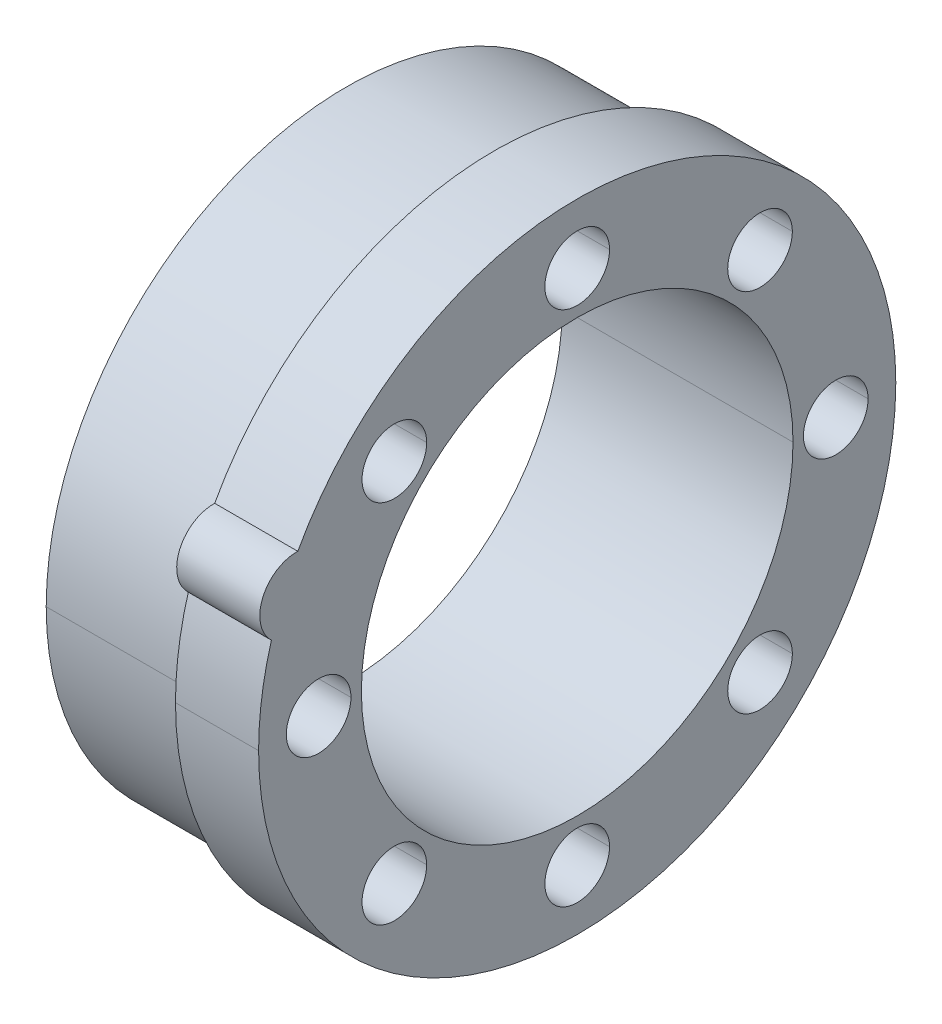
ISO-10303-21;
HEADER;
FILE_DESCRIPTION(('STEP AP214'),'2;1');
FILE_NAME('part.step','',(''),(''),'','','');
FILE_SCHEMA(('AUTOMOTIVE_DESIGN { 1 0 10303 214 1 1 1 1 }'));
ENDSEC;
DATA;
#1=APPLICATION_CONTEXT('core data for automotive mechanical design processes');
#2=APPLICATION_PROTOCOL_DEFINITION('international standard','automotive_design',2000,#1);
#3=PRODUCT_CONTEXT('',#1,'mechanical');
#4=PRODUCT('Part','Part','',(#3));
#5=PRODUCT_RELATED_PRODUCT_CATEGORY('part','',(#4));
#6=PRODUCT_DEFINITION_FORMATION('','',#4);
#7=PRODUCT_DEFINITION_CONTEXT('part definition',#1,'design');
#8=PRODUCT_DEFINITION('design','',#6,#7);
#9=PRODUCT_DEFINITION_SHAPE('','',#8);
#10=(LENGTH_UNIT() NAMED_UNIT(*) SI_UNIT(.MILLI.,.METRE.));
#11=(NAMED_UNIT(*) PLANE_ANGLE_UNIT() SI_UNIT($,.RADIAN.));
#12=(NAMED_UNIT(*) SI_UNIT($,.STERADIAN.) SOLID_ANGLE_UNIT());
#13=UNCERTAINTY_MEASURE_WITH_UNIT(LENGTH_MEASURE(1.E-05),#10,'distance_accuracy_value','');
#14=(GEOMETRIC_REPRESENTATION_CONTEXT(3) GLOBAL_UNCERTAINTY_ASSIGNED_CONTEXT((#13)) GLOBAL_UNIT_ASSIGNED_CONTEXT((#10,
#11,#12)) REPRESENTATION_CONTEXT('',''));
#15=CARTESIAN_POINT('',(0.,0.,0.));
#16=DIRECTION('',(0.,0.,1.));
#17=DIRECTION('',(1.,0.,0.));
#18=AXIS2_PLACEMENT_3D('',#15,#16,#17);
#19=CARTESIAN_POINT('',(4.68629150101524,12.5788044218399,30.3679202336462));
#20=DIRECTION('',(1.,0.,0.));
#21=DIRECTION('',(0.,0.,-1.));
#22=AXIS2_PLACEMENT_3D('',#19,#20,#21);
#23=CYLINDRICAL_SURFACE('',#22,4.);
#24=DIRECTION('',(1.,0.,0.));
#25=VECTOR('',#24,1.);
#26=CARTESIAN_POINT('',(20.5,16.5772472796418,30.2563195486432));
#27=LINE('',#26,#25);
#28=CARTESIAN_POINT('',(16.,16.5772472796418,30.2563195486432));
#29=VERTEX_POINT('',#28);
#30=CARTESIAN_POINT('',(25.,16.5772472796418,30.2563195486432));
#31=VERTEX_POINT('',#30);
#32=EDGE_CURVE('E331',#29,#31,#27,.T.);
#33=ORIENTED_EDGE('',*,*,#32,.F.);
#34=CARTESIAN_POINT('',(16.,12.5788044218399,30.3679202336462));
#35=DIRECTION('',(1.,0.,0.));
#36=DIRECTION('',(0.,0.,1.));
#37=AXIS2_PLACEMENT_3D('',#34,#35,#36);
#38=CIRCLE('',#37,4.);
#39=CARTESIAN_POINT('',(16.,9.67256476175049,33.116332691434));
#40=VERTEX_POINT('',#39);
#41=EDGE_CURVE('E27',#29,#40,#38,.T.);
#42=ORIENTED_EDGE('',*,*,#41,.T.);
#43=DIRECTION('',(-1.,0.,0.));
#44=VECTOR('',#43,1.);
#45=CARTESIAN_POINT('',(20.5,9.67256476175046,33.116332691434));
#46=LINE('',#45,#44);
#47=CARTESIAN_POINT('',(25.,9.67256476175046,33.116332691434));
#48=VERTEX_POINT('',#47);
#49=EDGE_CURVE('E401',#48,#40,#46,.T.);
#50=ORIENTED_EDGE('',*,*,#49,.F.);
#51=CARTESIAN_POINT('',(25.,12.5788044218399,30.3679202336462));
#52=DIRECTION('',(1.,0.,0.));
#53=DIRECTION('',(0.,0.,-1.));
#54=AXIS2_PLACEMENT_3D('',#51,#52,#53);
#55=CIRCLE('',#54,4.);
#56=EDGE_CURVE('E233',#31,#48,#55,.T.);
#57=ORIENTED_EDGE('',*,*,#56,.F.);
#58=EDGE_LOOP('',(#33,#42,#50,#57));
#59=FACE_BOUND('',#58,.T.);
#60=ADVANCED_FACE('F16',(#59),#23,.T.);
#61=CARTESIAN_POINT('',(0.,28.,0.));
#62=DIRECTION('',(1.,0.,0.));
#63=DIRECTION('',(0.,0.,-1.));
#64=AXIS2_PLACEMENT_3D('',#61,#62,#63);
#65=CYLINDRICAL_SURFACE('',#64,3.5);
#66=DIRECTION('',(1.,0.,0.));
#67=VECTOR('',#66,1.);
#68=CARTESIAN_POINT('',(0.,28.,3.5));
#69=LINE('',#68,#67);
#70=CARTESIAN_POINT('',(0.,28.,3.5));
#71=VERTEX_POINT('',#70);
#72=CARTESIAN_POINT('',(25.,28.,3.5));
#73=VERTEX_POINT('',#72);
#74=EDGE_CURVE('E225',#71,#73,#69,.T.);
#75=ORIENTED_EDGE('',*,*,#74,.F.);
#76=CARTESIAN_POINT('',(0.,28.,0.));
#77=DIRECTION('',(1.,0.,0.));
#78=DIRECTION('',(0.,0.,-1.));
#79=AXIS2_PLACEMENT_3D('',#76,#77,#78);
#80=CIRCLE('',#79,3.5);
#81=CARTESIAN_POINT('',(0.,28.,-3.5));
#82=VERTEX_POINT('',#81);
#83=EDGE_CURVE('E272',#82,#71,#80,.T.);
#84=ORIENTED_EDGE('',*,*,#83,.F.);
#85=DIRECTION('',(1.,0.,0.));
#86=VECTOR('',#85,1.);
#87=CARTESIAN_POINT('',(0.,28.,-3.5));
#88=LINE('',#87,#86);
#89=CARTESIAN_POINT('',(25.,28.,-3.5));
#90=VERTEX_POINT('',#89);
#91=EDGE_CURVE('E228',#82,#90,#88,.T.);
#92=ORIENTED_EDGE('',*,*,#91,.T.);
#93=CARTESIAN_POINT('',(25.,28.,0.));
#94=DIRECTION('',(1.,0.,0.));
#95=DIRECTION('',(0.,0.,-1.));
#96=AXIS2_PLACEMENT_3D('',#93,#94,#95);
#97=CIRCLE('',#96,3.5);
#98=EDGE_CURVE('E221',#90,#73,#97,.T.);
#99=ORIENTED_EDGE('',*,*,#98,.T.);
#100=EDGE_LOOP('',(#75,#84,#92,#99));
#101=FACE_BOUND('',#100,.T.);
#102=ADVANCED_FACE('F223',(#101),#65,.F.);
#103=CARTESIAN_POINT('',(0.,19.798989873225,-19.798989873224));
#104=DIRECTION('',(1.,0.,0.));
#105=DIRECTION('',(0.,0.,-1.));
#106=AXIS2_PLACEMENT_3D('',#103,#104,#105);
#107=CYLINDRICAL_SURFACE('',#106,3.50000000000023);
#108=DIRECTION('',(1.,0.,0.));
#109=VECTOR('',#108,1.);
#110=CARTESIAN_POINT('',(0.,19.798989873225,-16.2989898732238));
#111=LINE('',#110,#109);
#112=CARTESIAN_POINT('',(0.,19.798989873225,-16.2989898732238));
#113=VERTEX_POINT('',#112);
#114=CARTESIAN_POINT('',(25.,19.798989873225,-16.2989898732238));
#115=VERTEX_POINT('',#114);
#116=EDGE_CURVE('E284',#113,#115,#111,.T.);
#117=ORIENTED_EDGE('',*,*,#116,.F.);
#118=CARTESIAN_POINT('',(0.,19.798989873225,-19.798989873224));
#119=DIRECTION('',(1.,0.,0.));
#120=DIRECTION('',(0.,0.,-1.));
#121=AXIS2_PLACEMENT_3D('',#118,#119,#120);
#122=CIRCLE('',#121,3.50000000000023);
#123=CARTESIAN_POINT('',(0.,19.798989873225,-23.2989898732242));
#124=VERTEX_POINT('',#123);
#125=EDGE_CURVE('E276',#124,#113,#122,.T.);
#126=ORIENTED_EDGE('',*,*,#125,.F.);
#127=DIRECTION('',(1.,0.,0.));
#128=VECTOR('',#127,1.);
#129=CARTESIAN_POINT('',(0.,19.798989873225,-23.2989898732242));
#130=LINE('',#129,#128);
#131=CARTESIAN_POINT('',(25.,19.798989873225,-23.2989898732242));
#132=VERTEX_POINT('',#131);
#133=EDGE_CURVE('E313',#124,#132,#130,.T.);
#134=ORIENTED_EDGE('',*,*,#133,.T.);
#135=CARTESIAN_POINT('',(25.,19.798989873225,-19.798989873224));
#136=DIRECTION('',(1.,0.,0.));
#137=DIRECTION('',(0.,0.,-1.));
#138=AXIS2_PLACEMENT_3D('',#135,#136,#137);
#139=CIRCLE('',#138,3.50000000000023);
#140=EDGE_CURVE('E232',#132,#115,#139,.T.);
#141=ORIENTED_EDGE('',*,*,#140,.T.);
#142=EDGE_LOOP('',(#117,#126,#134,#141));
#143=FACE_BOUND('',#142,.T.);
#144=ADVANCED_FACE('F651',(#143),#107,.F.);
#145=CARTESIAN_POINT('',(0.,2.38228007559752E-12,-28.0000000000024));
#146=DIRECTION('',(1.,0.,0.));
#147=DIRECTION('',(0.,0.,-1.));
#148=AXIS2_PLACEMENT_3D('',#145,#146,#147);
#149=CYLINDRICAL_SURFACE('',#148,3.50000000000168);
#150=DIRECTION('',(1.,0.,0.));
#151=VECTOR('',#150,1.);
#152=CARTESIAN_POINT('',(0.,2.38270870197722E-12,-24.5000000000007));
#153=LINE('',#152,#151);
#154=CARTESIAN_POINT('',(0.,2.38270870197722E-12,-24.5000000000007));
#155=VERTEX_POINT('',#154);
#156=CARTESIAN_POINT('',(25.,2.38270870197722E-12,-24.5000000000007));
#157=VERTEX_POINT('',#156);
#158=EDGE_CURVE('E312',#155,#157,#153,.T.);
#159=ORIENTED_EDGE('',*,*,#158,.F.);
#160=CARTESIAN_POINT('',(0.,2.38228007559752E-12,-28.0000000000024));
#161=DIRECTION('',(1.,0.,0.));
#162=DIRECTION('',(0.,0.,-1.));
#163=AXIS2_PLACEMENT_3D('',#160,#161,#162);
#164=CIRCLE('',#163,3.50000000000168);
#165=CARTESIAN_POINT('',(0.,2.38228007559752E-12,-31.5000000000041));
#166=VERTEX_POINT('',#165);
#167=EDGE_CURVE('E356',#166,#155,#164,.T.);
#168=ORIENTED_EDGE('',*,*,#167,.F.);
#169=DIRECTION('',(1.,0.,0.));
#170=VECTOR('',#169,1.);
#171=CARTESIAN_POINT('',(0.,2.38228007559752E-12,-31.5000000000041));
#172=LINE('',#171,#170);
#173=CARTESIAN_POINT('',(25.,2.38228007559752E-12,-31.5000000000041));
#174=VERTEX_POINT('',#173);
#175=EDGE_CURVE('E377',#166,#174,#172,.T.);
#176=ORIENTED_EDGE('',*,*,#175,.T.);
#177=CARTESIAN_POINT('',(25.,2.38228007559752E-12,-28.0000000000024));
#178=DIRECTION('',(1.,0.,0.));
#179=DIRECTION('',(0.,0.,-1.));
#180=AXIS2_PLACEMENT_3D('',#177,#178,#179);
#181=CIRCLE('',#180,3.50000000000168);
#182=EDGE_CURVE('E264',#174,#157,#181,.T.);
#183=ORIENTED_EDGE('',*,*,#182,.T.);
#184=EDGE_LOOP('',(#159,#168,#176,#183));
#185=FACE_BOUND('',#184,.T.);
#186=ADVANCED_FACE('F646',(#185),#149,.F.);
#187=CARTESIAN_POINT('',(0.,-19.7989898732216,-19.7989898732274));
#188=DIRECTION('',(1.,0.,0.));
#189=DIRECTION('',(0.,0.,-1.));
#190=AXIS2_PLACEMENT_3D('',#187,#188,#189);
#191=CYLINDRICAL_SURFACE('',#190,3.50000000000353);
#192=DIRECTION('',(1.,0.,0.));
#193=VECTOR('',#192,1.);
#194=CARTESIAN_POINT('',(0.,-19.7989898732216,-16.2989898732238));
#195=LINE('',#194,#193);
#196=CARTESIAN_POINT('',(0.,-19.7989898732216,-16.2989898732238));
#197=VERTEX_POINT('',#196);
#198=CARTESIAN_POINT('',(25.,-19.7989898732216,-16.2989898732238));
#199=VERTEX_POINT('',#198);
#200=EDGE_CURVE('E298',#197,#199,#195,.T.);
#201=ORIENTED_EDGE('',*,*,#200,.F.);
#202=CARTESIAN_POINT('',(0.,-19.7989898732216,-19.7989898732274));
#203=DIRECTION('',(1.,0.,0.));
#204=DIRECTION('',(0.,0.,-1.));
#205=AXIS2_PLACEMENT_3D('',#202,#203,#204);
#206=CIRCLE('',#205,3.50000000000353);
#207=CARTESIAN_POINT('',(0.,-19.7989898732216,-23.2989898732309));
#208=VERTEX_POINT('',#207);
#209=EDGE_CURVE('E360',#208,#197,#206,.T.);
#210=ORIENTED_EDGE('',*,*,#209,.F.);
#211=DIRECTION('',(1.,0.,0.));
#212=VECTOR('',#211,1.);
#213=CARTESIAN_POINT('',(0.,-19.7989898732216,-23.2989898732309));
#214=LINE('',#213,#212);
#215=CARTESIAN_POINT('',(25.,-19.7989898732216,-23.2989898732309));
#216=VERTEX_POINT('',#215);
#217=EDGE_CURVE('E297',#208,#216,#214,.T.);
#218=ORIENTED_EDGE('',*,*,#217,.T.);
#219=CARTESIAN_POINT('',(25.,-19.7989898732216,-19.7989898732274));
#220=DIRECTION('',(1.,0.,0.));
#221=DIRECTION('',(0.,0.,-1.));
#222=AXIS2_PLACEMENT_3D('',#219,#220,#221);
#223=CIRCLE('',#222,3.50000000000353);
#224=EDGE_CURVE('E260',#216,#199,#223,.T.);
#225=ORIENTED_EDGE('',*,*,#224,.T.);
#226=EDGE_LOOP('',(#201,#210,#218,#225));
#227=FACE_BOUND('',#226,.T.);
#228=ADVANCED_FACE('F609',(#227),#191,.F.);
#229=CARTESIAN_POINT('',(0.,-28.,-4.76456015119504E-12));
#230=DIRECTION('',(1.,0.,0.));
#231=DIRECTION('',(0.,0.,-1.));
#232=AXIS2_PLACEMENT_3D('',#229,#230,#231);
#233=CYLINDRICAL_SURFACE('',#232,3.50000000000475);
#234=DIRECTION('',(1.,0.,0.));
#235=VECTOR('',#234,1.);
#236=CARTESIAN_POINT('',(0.,-28.,3.5));
#237=LINE('',#236,#235);
#238=CARTESIAN_POINT('',(0.,-28.,3.5));
#239=VERTEX_POINT('',#238);
#240=CARTESIAN_POINT('',(25.,-28.,3.5));
#241=VERTEX_POINT('',#240);
#242=EDGE_CURVE('E317',#239,#241,#237,.T.);
#243=ORIENTED_EDGE('',*,*,#242,.F.);
#244=CARTESIAN_POINT('',(0.,-28.,-4.76456015119504E-12));
#245=DIRECTION('',(1.,0.,0.));
#246=DIRECTION('',(0.,0.,-1.));
#247=AXIS2_PLACEMENT_3D('',#244,#245,#246);
#248=CIRCLE('',#247,3.50000000000475);
#249=CARTESIAN_POINT('',(0.,-28.,-3.5000000000095));
#250=VERTEX_POINT('',#249);
#251=EDGE_CURVE('E303',#250,#239,#248,.T.);
#252=ORIENTED_EDGE('',*,*,#251,.F.);
#253=DIRECTION('',(1.,0.,0.));
#254=VECTOR('',#253,1.);
#255=CARTESIAN_POINT('',(0.,-28.,-3.5000000000095));
#256=LINE('',#255,#254);
#257=CARTESIAN_POINT('',(25.,-28.,-3.5000000000095));
#258=VERTEX_POINT('',#257);
#259=EDGE_CURVE('E253',#250,#258,#256,.T.);
#260=ORIENTED_EDGE('',*,*,#259,.T.);
#261=CARTESIAN_POINT('',(25.,-28.,-4.76456015119504E-12));
#262=DIRECTION('',(1.,0.,0.));
#263=DIRECTION('',(0.,0.,-1.));
#264=AXIS2_PLACEMENT_3D('',#261,#262,#263);
#265=CIRCLE('',#264,3.50000000000475);
#266=EDGE_CURVE('E263',#258,#241,#265,.T.);
#267=ORIENTED_EDGE('',*,*,#266,.T.);
#268=EDGE_LOOP('',(#243,#252,#260,#267));
#269=FACE_BOUND('',#268,.T.);
#270=ADVANCED_FACE('F603',(#269),#233,.F.);
#271=CARTESIAN_POINT('',(0.,-19.798989873225,19.7989898732192));
#272=DIRECTION('',(1.,0.,0.));
#273=DIRECTION('',(0.,0.,-1.));
#274=AXIS2_PLACEMENT_3D('',#271,#272,#273);
#275=CYLINDRICAL_SURFACE('',#274,3.50000000000462);
#276=DIRECTION('',(1.,0.,0.));
#277=VECTOR('',#276,1.);
#278=CARTESIAN_POINT('',(0.,-19.798989873225,23.2989898732239));
#279=LINE('',#278,#277);
#280=CARTESIAN_POINT('',(0.,-19.798989873225,23.2989898732239));
#281=VERTEX_POINT('',#280);
#282=CARTESIAN_POINT('',(25.,-19.798989873225,23.2989898732239));
#283=VERTEX_POINT('',#282);
#284=EDGE_CURVE('E258',#281,#283,#279,.T.);
#285=ORIENTED_EDGE('',*,*,#284,.F.);
#286=CARTESIAN_POINT('',(0.,-19.798989873225,19.7989898732192));
#287=DIRECTION('',(1.,0.,0.));
#288=DIRECTION('',(0.,0.,-1.));
#289=AXIS2_PLACEMENT_3D('',#286,#287,#288);
#290=CIRCLE('',#289,3.50000000000462);
#291=CARTESIAN_POINT('',(0.,-19.798989873225,16.2989898732147));
#292=VERTEX_POINT('',#291);
#293=EDGE_CURVE('E299',#292,#281,#290,.T.);
#294=ORIENTED_EDGE('',*,*,#293,.F.);
#295=DIRECTION('',(1.,0.,0.));
#296=VECTOR('',#295,1.);
#297=CARTESIAN_POINT('',(0.,-19.798989873225,16.2989898732147));
#298=LINE('',#297,#296);
#299=CARTESIAN_POINT('',(25.,-19.798989873225,16.2989898732147));
#300=VERTEX_POINT('',#299);
#301=EDGE_CURVE('E20',#292,#300,#298,.T.);
#302=ORIENTED_EDGE('',*,*,#301,.T.);
#303=CARTESIAN_POINT('',(25.,-19.798989873225,19.7989898732192));
#304=DIRECTION('',(1.,0.,0.));
#305=DIRECTION('',(0.,0.,-1.));
#306=AXIS2_PLACEMENT_3D('',#303,#304,#305);
#307=CIRCLE('',#306,3.50000000000462);
#308=EDGE_CURVE('E363',#300,#283,#307,.T.);
#309=ORIENTED_EDGE('',*,*,#308,.T.);
#310=EDGE_LOOP('',(#285,#294,#302,#309));
#311=FACE_BOUND('',#310,.T.);
#312=ADVANCED_FACE('F608',(#311),#275,.F.);
#313=CARTESIAN_POINT('',(0.,-2.38570908663513E-12,27.9999999999976));
#314=DIRECTION('',(1.,0.,0.));
#315=DIRECTION('',(0.,0.,-1.));
#316=AXIS2_PLACEMENT_3D('',#313,#314,#315);
#317=CYLINDRICAL_SURFACE('',#316,3.50000000000326);
#318=DIRECTION('',(1.,0.,0.));
#319=VECTOR('',#318,1.);
#320=CARTESIAN_POINT('',(0.,-2.38528046025543E-12,31.5000000000009));
#321=LINE('',#320,#319);
#322=CARTESIAN_POINT('',(0.,-2.38528046025543E-12,31.5000000000009));
#323=VERTEX_POINT('',#322);
#324=CARTESIAN_POINT('',(25.,-2.38528046025543E-12,31.5000000000009));
#325=VERTEX_POINT('',#324);
#326=EDGE_CURVE('E369',#323,#325,#321,.T.);
#327=ORIENTED_EDGE('',*,*,#326,.F.);
#328=CARTESIAN_POINT('',(0.,-2.38570908663513E-12,27.9999999999976));
#329=DIRECTION('',(1.,0.,0.));
#330=DIRECTION('',(0.,0.,-1.));
#331=AXIS2_PLACEMENT_3D('',#328,#329,#330);
#332=CIRCLE('',#331,3.50000000000326);
#333=CARTESIAN_POINT('',(0.,-2.38570908663513E-12,24.4999999999943));
#334=VERTEX_POINT('',#333);
#335=EDGE_CURVE('E302',#334,#323,#332,.T.);
#336=ORIENTED_EDGE('',*,*,#335,.F.);
#337=DIRECTION('',(1.,0.,0.));
#338=VECTOR('',#337,1.);
#339=CARTESIAN_POINT('',(0.,-2.38570908663513E-12,24.4999999999943));
#340=LINE('',#339,#338);
#341=CARTESIAN_POINT('',(25.,-2.38570908663513E-12,24.4999999999943));
#342=VERTEX_POINT('',#341);
#343=EDGE_CURVE('E368',#334,#342,#340,.T.);
#344=ORIENTED_EDGE('',*,*,#343,.T.);
#345=CARTESIAN_POINT('',(25.,-2.38570908663513E-12,27.9999999999976));
#346=DIRECTION('',(1.,0.,0.));
#347=DIRECTION('',(0.,0.,-1.));
#348=AXIS2_PLACEMENT_3D('',#345,#346,#347);
#349=CIRCLE('',#348,3.50000000000326);
#350=EDGE_CURVE('E355',#342,#325,#349,.T.);
#351=ORIENTED_EDGE('',*,*,#350,.T.);
#352=EDGE_LOOP('',(#327,#336,#344,#351));
#353=FACE_BOUND('',#352,.T.);
#354=ADVANCED_FACE('F689',(#353),#317,.F.);
#355=CARTESIAN_POINT('',(0.,19.7989898732216,19.7989898732226));
#356=DIRECTION('',(1.,0.,0.));
#357=DIRECTION('',(0.,0.,-1.));
#358=AXIS2_PLACEMENT_3D('',#355,#356,#357);
#359=CYLINDRICAL_SURFACE('',#358,3.50000000000149);
#360=DIRECTION('',(1.,0.,0.));
#361=VECTOR('',#360,1.);
#362=CARTESIAN_POINT('',(0.,19.7989898732216,23.2989898732241));
#363=LINE('',#362,#361);
#364=CARTESIAN_POINT('',(0.,19.7989898732216,23.2989898732241));
#365=VERTEX_POINT('',#364);
#366=CARTESIAN_POINT('',(25.,19.7989898732216,23.2989898732241));
#367=VERTEX_POINT('',#366);
#368=EDGE_CURVE('E385',#365,#367,#363,.T.);
#369=ORIENTED_EDGE('',*,*,#368,.F.);
#370=CARTESIAN_POINT('',(0.,19.7989898732216,19.7989898732226));
#371=DIRECTION('',(1.,0.,0.));
#372=DIRECTION('',(0.,0.,-1.));
#373=AXIS2_PLACEMENT_3D('',#370,#371,#372);
#374=CIRCLE('',#373,3.50000000000149);
#375=CARTESIAN_POINT('',(0.,19.7989898732216,16.2989898732211));
#376=VERTEX_POINT('',#375);
#377=EDGE_CURVE('E427',#376,#365,#374,.T.);
#378=ORIENTED_EDGE('',*,*,#377,.F.);
#379=DIRECTION('',(1.,0.,0.));
#380=VECTOR('',#379,1.);
#381=CARTESIAN_POINT('',(0.,19.7989898732216,16.2989898732211));
#382=LINE('',#381,#380);
#383=CARTESIAN_POINT('',(25.,19.7989898732216,16.2989898732211));
#384=VERTEX_POINT('',#383);
#385=EDGE_CURVE('E347',#376,#384,#382,.T.);
#386=ORIENTED_EDGE('',*,*,#385,.T.);
#387=CARTESIAN_POINT('',(25.,19.7989898732216,19.7989898732226));
#388=DIRECTION('',(1.,0.,0.));
#389=DIRECTION('',(0.,0.,-1.));
#390=AXIS2_PLACEMENT_3D('',#387,#388,#389);
#391=CIRCLE('',#390,3.50000000000149);
#392=EDGE_CURVE('E268',#384,#367,#391,.T.);
#393=ORIENTED_EDGE('',*,*,#392,.T.);
#394=EDGE_LOOP('',(#369,#378,#386,#393));
#395=FACE_BOUND('',#394,.T.);
#396=ADVANCED_FACE('F683',(#395),#359,.F.);
#397=CARTESIAN_POINT('',(16.,0.,0.));
#398=DIRECTION('',(-1.,0.,0.));
#399=DIRECTION('',(0.,0.,1.));
#400=AXIS2_PLACEMENT_3D('',#397,#398,#399);
#401=CYLINDRICAL_SURFACE('',#400,32.5);
#402=DIRECTION('',(-1.,0.,0.));
#403=VECTOR('',#402,1.);
#404=CARTESIAN_POINT('',(16.,0.,-32.5));
#405=LINE('',#404,#403);
#406=CARTESIAN_POINT('',(16.,0.,-32.5));
#407=VERTEX_POINT('',#406);
#408=CARTESIAN_POINT('',(0.,0.,-32.5));
#409=VERTEX_POINT('',#408);
#410=EDGE_CURVE('E392',#407,#409,#405,.T.);
#411=ORIENTED_EDGE('',*,*,#410,.F.);
#412=CARTESIAN_POINT('',(16.,0.,0.));
#413=DIRECTION('',(-1.,0.,0.));
#414=DIRECTION('',(0.,0.,1.));
#415=AXIS2_PLACEMENT_3D('',#412,#413,#414);
#416=CIRCLE('',#415,32.5);
#417=CARTESIAN_POINT('',(16.,0.,32.5));
#418=VERTEX_POINT('',#417);
#419=EDGE_CURVE('E10',#407,#418,#416,.T.);
#420=ORIENTED_EDGE('',*,*,#419,.T.);
#421=DIRECTION('',(-1.,0.,0.));
#422=VECTOR('',#421,1.);
#423=CARTESIAN_POINT('',(16.,0.,32.5));
#424=LINE('',#423,#422);
#425=CARTESIAN_POINT('',(0.,0.,32.5));
#426=VERTEX_POINT('',#425);
#427=EDGE_CURVE('E283',#418,#426,#424,.T.);
#428=ORIENTED_EDGE('',*,*,#427,.T.);
#429=CARTESIAN_POINT('',(0.,0.,0.));
#430=DIRECTION('',(-1.,0.,0.));
#431=DIRECTION('',(0.,0.,1.));
#432=AXIS2_PLACEMENT_3D('',#429,#430,#431);
#433=CIRCLE('',#432,32.5);
#434=EDGE_CURVE('E277',#409,#426,#433,.T.);
#435=ORIENTED_EDGE('',*,*,#434,.F.);
#436=EDGE_LOOP('',(#411,#420,#428,#435));
#437=FACE_BOUND('',#436,.T.);
#438=ADVANCED_FACE('F688',(#437),#401,.T.);
#439=CARTESIAN_POINT('',(16.,0.,0.));
#440=DIRECTION('',(-1.,0.,0.));
#441=DIRECTION('',(0.,0.,1.));
#442=AXIS2_PLACEMENT_3D('',#439,#440,#441);
#443=PLANE('',#442);
#444=CARTESIAN_POINT('',(16.,0.,0.));
#445=DIRECTION('',(-1.,0.,0.));
#446=DIRECTION('',(0.,0.,1.));
#447=AXIS2_PLACEMENT_3D('',#444,#445,#446);
#448=CIRCLE('',#447,32.5);
#449=EDGE_CURVE('E351',#418,#407,#448,.T.);
#450=ORIENTED_EDGE('',*,*,#449,.F.);
#451=ORIENTED_EDGE('',*,*,#419,.F.);
#452=EDGE_LOOP('',(#450,#451));
#453=FACE_BOUND('',#452,.T.);
#454=CARTESIAN_POINT('',(16.,0.,0.));
#455=DIRECTION('',(-1.,0.,0.));
#456=DIRECTION('',(0.,0.,1.));
#457=AXIS2_PLACEMENT_3D('',#454,#455,#456);
#458=CIRCLE('',#457,34.5);
#459=CARTESIAN_POINT('',(16.,0.,-34.5));
#460=VERTEX_POINT('',#459);
#461=EDGE_CURVE('E336',#29,#460,#458,.T.);
#462=ORIENTED_EDGE('',*,*,#461,.T.);
#463=CARTESIAN_POINT('',(16.,0.,0.));
#464=DIRECTION('',(-1.,0.,0.));
#465=DIRECTION('',(0.,0.,1.));
#466=AXIS2_PLACEMENT_3D('',#463,#464,#465);
#467=CIRCLE('',#466,34.5);
#468=CARTESIAN_POINT('',(16.,0.,34.5));
#469=VERTEX_POINT('',#468);
#470=EDGE_CURVE('E370',#460,#469,#467,.T.);
#471=ORIENTED_EDGE('',*,*,#470,.T.);
#472=CARTESIAN_POINT('',(16.,0.,0.));
#473=DIRECTION('',(-1.,0.,0.));
#474=DIRECTION('',(0.,0.,1.));
#475=AXIS2_PLACEMENT_3D('',#472,#473,#474);
#476=CIRCLE('',#475,34.5);
#477=EDGE_CURVE('E398',#469,#40,#476,.T.);
#478=ORIENTED_EDGE('',*,*,#477,.T.);
#479=ORIENTED_EDGE('',*,*,#41,.F.);
#480=EDGE_LOOP('',(#462,#471,#478,#479));
#481=FACE_BOUND('',#480,.T.);
#482=ADVANCED_FACE('F464',(#453,#481),#443,.T.);
#483=CARTESIAN_POINT('',(25.,0.,0.));
#484=DIRECTION('',(-1.,0.,0.));
#485=DIRECTION('',(0.,0.,1.));
#486=AXIS2_PLACEMENT_3D('',#483,#484,#485);
#487=CYLINDRICAL_SURFACE('',#486,23.37);
#488=DIRECTION('',(-1.,0.,0.));
#489=VECTOR('',#488,1.);
#490=CARTESIAN_POINT('',(25.,0.,-23.37));
#491=LINE('',#490,#489);
#492=CARTESIAN_POINT('',(25.,0.,-23.37));
#493=VERTEX_POINT('',#492);
#494=CARTESIAN_POINT('',(0.,0.,-23.37));
#495=VERTEX_POINT('',#494);
#496=EDGE_CURVE('E282',#493,#495,#491,.T.);
#497=ORIENTED_EDGE('',*,*,#496,.F.);
#498=CARTESIAN_POINT('',(25.,0.,0.));
#499=DIRECTION('',(1.,0.,0.));
#500=DIRECTION('',(0.,0.,-1.));
#501=AXIS2_PLACEMENT_3D('',#498,#499,#500);
#502=CIRCLE('',#501,23.37);
#503=CARTESIAN_POINT('',(25.,0.,23.37));
#504=VERTEX_POINT('',#503);
#505=EDGE_CURVE('E265',#493,#504,#502,.T.);
#506=ORIENTED_EDGE('',*,*,#505,.T.);
#507=DIRECTION('',(-1.,0.,0.));
#508=VECTOR('',#507,1.);
#509=CARTESIAN_POINT('',(25.,0.,23.37));
#510=LINE('',#509,#508);
#511=CARTESIAN_POINT('',(0.,0.,23.37));
#512=VERTEX_POINT('',#511);
#513=EDGE_CURVE('E330',#504,#512,#510,.T.);
#514=ORIENTED_EDGE('',*,*,#513,.T.);
#515=CARTESIAN_POINT('',(0.,0.,0.));
#516=DIRECTION('',(1.,0.,0.));
#517=DIRECTION('',(0.,0.,-1.));
#518=AXIS2_PLACEMENT_3D('',#515,#516,#517);
#519=CIRCLE('',#518,23.37);
#520=EDGE_CURVE('E429',#495,#512,#519,.T.);
#521=ORIENTED_EDGE('',*,*,#520,.F.);
#522=EDGE_LOOP('',(#497,#506,#514,#521));
#523=FACE_BOUND('',#522,.T.);
#524=ADVANCED_FACE('F18',(#523),#487,.F.);
#525=CARTESIAN_POINT('',(25.,0.,0.));
#526=DIRECTION('',(1.,0.,0.));
#527=DIRECTION('',(0.,1.,0.));
#528=AXIS2_PLACEMENT_3D('',#525,#526,#527);
#529=PLANE('',#528);
#530=CARTESIAN_POINT('',(25.,0.,0.));
#531=DIRECTION('',(1.,0.,0.));
#532=DIRECTION('',(0.,0.,-1.));
#533=AXIS2_PLACEMENT_3D('',#530,#531,#532);
#534=CIRCLE('',#533,23.37);
#535=EDGE_CURVE('E278',#504,#493,#534,.T.);
#536=ORIENTED_EDGE('',*,*,#535,.F.);
#537=ORIENTED_EDGE('',*,*,#505,.F.);
#538=EDGE_LOOP('',(#536,#537));
#539=FACE_BOUND('',#538,.T.);
#540=ORIENTED_EDGE('',*,*,#392,.F.);
#541=CARTESIAN_POINT('',(25.,19.7989898732216,19.7989898732226));
#542=DIRECTION('',(1.,0.,0.));
#543=DIRECTION('',(0.,0.,-1.));
#544=AXIS2_PLACEMENT_3D('',#541,#542,#543);
#545=CIRCLE('',#544,3.50000000000149);
#546=EDGE_CURVE('E352',#367,#384,#545,.T.);
#547=ORIENTED_EDGE('',*,*,#546,.F.);
#548=EDGE_LOOP('',(#540,#547));
#549=FACE_BOUND('',#548,.T.);
#550=ORIENTED_EDGE('',*,*,#350,.F.);
#551=CARTESIAN_POINT('',(25.,-2.38570908663513E-12,27.9999999999976));
#552=DIRECTION('',(1.,0.,0.));
#553=DIRECTION('',(0.,0.,-1.));
#554=AXIS2_PLACEMENT_3D('',#551,#552,#553);
#555=CIRCLE('',#554,3.50000000000326);
#556=EDGE_CURVE('E364',#325,#342,#555,.T.);
#557=ORIENTED_EDGE('',*,*,#556,.F.);
#558=EDGE_LOOP('',(#550,#557));
#559=FACE_BOUND('',#558,.T.);
#560=ORIENTED_EDGE('',*,*,#308,.F.);
#561=CARTESIAN_POINT('',(25.,-19.798989873225,19.7989898732192));
#562=DIRECTION('',(1.,0.,0.));
#563=DIRECTION('',(0.,0.,-1.));
#564=AXIS2_PLACEMENT_3D('',#561,#562,#563);
#565=CIRCLE('',#564,3.50000000000462);
#566=EDGE_CURVE('E307',#283,#300,#565,.T.);
#567=ORIENTED_EDGE('',*,*,#566,.F.);
#568=EDGE_LOOP('',(#560,#567));
#569=FACE_BOUND('',#568,.T.);
#570=ORIENTED_EDGE('',*,*,#266,.F.);
#571=CARTESIAN_POINT('',(25.,-28.,-4.76456015119504E-12));
#572=DIRECTION('',(1.,0.,0.));
#573=DIRECTION('',(0.,0.,-1.));
#574=AXIS2_PLACEMENT_3D('',#571,#572,#573);
#575=CIRCLE('',#574,3.50000000000475);
#576=EDGE_CURVE('E321',#241,#258,#575,.T.);
#577=ORIENTED_EDGE('',*,*,#576,.F.);
#578=EDGE_LOOP('',(#570,#577));
#579=FACE_BOUND('',#578,.T.);
#580=ORIENTED_EDGE('',*,*,#224,.F.);
#581=CARTESIAN_POINT('',(25.,-19.7989898732216,-19.7989898732274));
#582=DIRECTION('',(1.,0.,0.));
#583=DIRECTION('',(0.,0.,-1.));
#584=AXIS2_PLACEMENT_3D('',#581,#582,#583);
#585=CIRCLE('',#584,3.50000000000353);
#586=EDGE_CURVE('E293',#199,#216,#585,.T.);
#587=ORIENTED_EDGE('',*,*,#586,.F.);
#588=EDGE_LOOP('',(#580,#587));
#589=FACE_BOUND('',#588,.T.);
#590=ORIENTED_EDGE('',*,*,#182,.F.);
#591=CARTESIAN_POINT('',(25.,2.38228007559752E-12,-28.0000000000024));
#592=DIRECTION('',(1.,0.,0.));
#593=DIRECTION('',(0.,0.,-1.));
#594=AXIS2_PLACEMENT_3D('',#591,#592,#593);
#595=CIRCLE('',#594,3.50000000000168);
#596=EDGE_CURVE('E405',#157,#174,#595,.T.);
#597=ORIENTED_EDGE('',*,*,#596,.F.);
#598=EDGE_LOOP('',(#590,#597));
#599=FACE_BOUND('',#598,.T.);
#600=ORIENTED_EDGE('',*,*,#140,.F.);
#601=CARTESIAN_POINT('',(25.,19.798989873225,-19.798989873224));
#602=DIRECTION('',(1.,0.,0.));
#603=DIRECTION('',(0.,0.,-1.));
#604=AXIS2_PLACEMENT_3D('',#601,#602,#603);
#605=CIRCLE('',#604,3.50000000000023);
#606=EDGE_CURVE('E288',#115,#132,#605,.T.);
#607=ORIENTED_EDGE('',*,*,#606,.F.);
#608=EDGE_LOOP('',(#600,#607));
#609=FACE_BOUND('',#608,.T.);
#610=ORIENTED_EDGE('',*,*,#98,.F.);
#611=CARTESIAN_POINT('',(25.,28.,0.));
#612=DIRECTION('',(1.,0.,0.));
#613=DIRECTION('',(0.,0.,-1.));
#614=AXIS2_PLACEMENT_3D('',#611,#612,#613);
#615=CIRCLE('',#614,3.5);
#616=EDGE_CURVE('E235',#73,#90,#615,.T.);
#617=ORIENTED_EDGE('',*,*,#616,.F.);
#618=EDGE_LOOP('',(#610,#617));
#619=FACE_BOUND('',#618,.T.);
#620=CARTESIAN_POINT('',(25.,0.,0.));
#621=DIRECTION('',(1.,0.,0.));
#622=DIRECTION('',(0.,0.,-1.));
#623=AXIS2_PLACEMENT_3D('',#620,#621,#622);
#624=CIRCLE('',#623,34.5);
#625=CARTESIAN_POINT('',(25.,0.,34.5));
#626=VERTEX_POINT('',#625);
#627=EDGE_CURVE('E449',#48,#626,#624,.T.);
#628=ORIENTED_EDGE('',*,*,#627,.T.);
#629=CARTESIAN_POINT('',(25.,0.,0.));
#630=DIRECTION('',(1.,0.,0.));
#631=DIRECTION('',(0.,0.,-1.));
#632=AXIS2_PLACEMENT_3D('',#629,#630,#631);
#633=CIRCLE('',#632,34.5);
#634=CARTESIAN_POINT('',(25.,0.,-34.5));
#635=VERTEX_POINT('',#634);
#636=EDGE_CURVE('E335',#626,#635,#633,.T.);
#637=ORIENTED_EDGE('',*,*,#636,.T.);
#638=CARTESIAN_POINT('',(25.,0.,0.));
#639=DIRECTION('',(1.,0.,0.));
#640=DIRECTION('',(0.,0.,-1.));
#641=AXIS2_PLACEMENT_3D('',#638,#639,#640);
#642=CIRCLE('',#641,34.5);
#643=EDGE_CURVE('E325',#635,#31,#642,.T.);
#644=ORIENTED_EDGE('',*,*,#643,.T.);
#645=ORIENTED_EDGE('',*,*,#56,.T.);
#646=EDGE_LOOP('',(#628,#637,#644,#645));
#647=FACE_BOUND('',#646,.T.);
#648=ADVANCED_FACE('F236',(#539,#549,#559,#569,#579,#589,#599,#609,#619,#647),#529,.T.);
#649=CARTESIAN_POINT('',(25.,0.,0.));
#650=DIRECTION('',(-1.,0.,0.));
#651=DIRECTION('',(0.,0.,1.));
#652=AXIS2_PLACEMENT_3D('',#649,#650,#651);
#653=CYLINDRICAL_SURFACE('',#652,34.5);
#654=DIRECTION('',(-1.,0.,0.));
#655=VECTOR('',#654,1.);
#656=CARTESIAN_POINT('',(25.,0.,34.5));
#657=LINE('',#656,#655);
#658=EDGE_CURVE('E343',#626,#469,#657,.T.);
#659=ORIENTED_EDGE('',*,*,#658,.F.);
#660=ORIENTED_EDGE('',*,*,#627,.F.);
#661=ORIENTED_EDGE('',*,*,#49,.T.);
#662=ORIENTED_EDGE('',*,*,#477,.F.);
#663=EDGE_LOOP('',(#659,#660,#661,#662));
#664=FACE_BOUND('',#663,.T.);
#665=ADVANCED_FACE('F462',(#664),#653,.T.);
#666=CARTESIAN_POINT('',(0.,0.,0.));
#667=DIRECTION('',(1.,0.,0.));
#668=DIRECTION('',(0.,1.,0.));
#669=AXIS2_PLACEMENT_3D('',#666,#667,#668);
#670=PLANE('',#669);
#671=CARTESIAN_POINT('',(0.,0.,0.));
#672=DIRECTION('',(1.,0.,0.));
#673=DIRECTION('',(0.,0.,-1.));
#674=AXIS2_PLACEMENT_3D('',#671,#672,#673);
#675=CIRCLE('',#674,23.37);
#676=EDGE_CURVE('E292',#512,#495,#675,.T.);
#677=ORIENTED_EDGE('',*,*,#676,.T.);
#678=ORIENTED_EDGE('',*,*,#520,.T.);
#679=EDGE_LOOP('',(#677,#678));
#680=FACE_BOUND('',#679,.T.);
#681=ORIENTED_EDGE('',*,*,#377,.T.);
#682=CARTESIAN_POINT('',(0.,19.7989898732216,19.7989898732226));
#683=DIRECTION('',(1.,0.,0.));
#684=DIRECTION('',(0.,0.,-1.));
#685=AXIS2_PLACEMENT_3D('',#682,#683,#684);
#686=CIRCLE('',#685,3.50000000000149);
#687=EDGE_CURVE('E381',#365,#376,#686,.T.);
#688=ORIENTED_EDGE('',*,*,#687,.T.);
#689=EDGE_LOOP('',(#681,#688));
#690=FACE_BOUND('',#689,.T.);
#691=ORIENTED_EDGE('',*,*,#335,.T.);
#692=CARTESIAN_POINT('',(0.,-2.38570908663513E-12,27.9999999999976));
#693=DIRECTION('',(1.,0.,0.));
#694=DIRECTION('',(0.,0.,-1.));
#695=AXIS2_PLACEMENT_3D('',#692,#693,#694);
#696=CIRCLE('',#695,3.50000000000326);
#697=EDGE_CURVE('E431',#323,#334,#696,.T.);
#698=ORIENTED_EDGE('',*,*,#697,.T.);
#699=EDGE_LOOP('',(#691,#698));
#700=FACE_BOUND('',#699,.T.);
#701=ORIENTED_EDGE('',*,*,#293,.T.);
#702=CARTESIAN_POINT('',(0.,-19.798989873225,19.7989898732192));
#703=DIRECTION('',(1.,0.,0.));
#704=DIRECTION('',(0.,0.,-1.));
#705=AXIS2_PLACEMENT_3D('',#702,#703,#704);
#706=CIRCLE('',#705,3.50000000000462);
#707=EDGE_CURVE('E255',#281,#292,#706,.T.);
#708=ORIENTED_EDGE('',*,*,#707,.T.);
#709=EDGE_LOOP('',(#701,#708));
#710=FACE_BOUND('',#709,.T.);
#711=ORIENTED_EDGE('',*,*,#251,.T.);
#712=CARTESIAN_POINT('',(0.,-28.,-4.76456015119504E-12));
#713=DIRECTION('',(1.,0.,0.));
#714=DIRECTION('',(0.,0.,-1.));
#715=AXIS2_PLACEMENT_3D('',#712,#713,#714);
#716=CIRCLE('',#715,3.50000000000475);
#717=EDGE_CURVE('E322',#239,#250,#716,.T.);
#718=ORIENTED_EDGE('',*,*,#717,.T.);
#719=EDGE_LOOP('',(#711,#718));
#720=FACE_BOUND('',#719,.T.);
#721=ORIENTED_EDGE('',*,*,#209,.T.);
#722=CARTESIAN_POINT('',(0.,-19.7989898732216,-19.7989898732274));
#723=DIRECTION('',(1.,0.,0.));
#724=DIRECTION('',(0.,0.,-1.));
#725=AXIS2_PLACEMENT_3D('',#722,#723,#724);
#726=CIRCLE('',#725,3.50000000000353);
#727=EDGE_CURVE('E340',#197,#208,#726,.T.);
#728=ORIENTED_EDGE('',*,*,#727,.T.);
#729=EDGE_LOOP('',(#721,#728));
#730=FACE_BOUND('',#729,.T.);
#731=ORIENTED_EDGE('',*,*,#167,.T.);
#732=CARTESIAN_POINT('',(0.,2.38228007559752E-12,-28.0000000000024));
#733=DIRECTION('',(1.,0.,0.));
#734=DIRECTION('',(0.,0.,-1.));
#735=AXIS2_PLACEMENT_3D('',#732,#733,#734);
#736=CIRCLE('',#735,3.50000000000168);
#737=EDGE_CURVE('E308',#155,#166,#736,.T.);
#738=ORIENTED_EDGE('',*,*,#737,.T.);
#739=EDGE_LOOP('',(#731,#738));
#740=FACE_BOUND('',#739,.T.);
#741=ORIENTED_EDGE('',*,*,#125,.T.);
#742=CARTESIAN_POINT('',(0.,19.798989873225,-19.798989873224));
#743=DIRECTION('',(1.,0.,0.));
#744=DIRECTION('',(0.,0.,-1.));
#745=AXIS2_PLACEMENT_3D('',#742,#743,#744);
#746=CIRCLE('',#745,3.50000000000023);
#747=EDGE_CURVE('E271',#113,#124,#746,.T.);
#748=ORIENTED_EDGE('',*,*,#747,.T.);
#749=EDGE_LOOP('',(#741,#748));
#750=FACE_BOUND('',#749,.T.);
#751=ORIENTED_EDGE('',*,*,#83,.T.);
#752=CARTESIAN_POINT('',(0.,28.,0.));
#753=DIRECTION('',(1.,0.,0.));
#754=DIRECTION('',(0.,0.,-1.));
#755=AXIS2_PLACEMENT_3D('',#752,#753,#754);
#756=CIRCLE('',#755,3.5);
#757=EDGE_CURVE('E243',#71,#82,#756,.T.);
#758=ORIENTED_EDGE('',*,*,#757,.T.);
#759=EDGE_LOOP('',(#751,#758));
#760=FACE_BOUND('',#759,.T.);
#761=CARTESIAN_POINT('',(0.,0.,0.));
#762=DIRECTION('',(-1.,0.,0.));
#763=DIRECTION('',(0.,0.,1.));
#764=AXIS2_PLACEMENT_3D('',#761,#762,#763);
#765=CIRCLE('',#764,32.5);
#766=EDGE_CURVE('E391',#426,#409,#765,.T.);
#767=ORIENTED_EDGE('',*,*,#766,.T.);
#768=ORIENTED_EDGE('',*,*,#434,.T.);
#769=EDGE_LOOP('',(#767,#768));
#770=FACE_BOUND('',#769,.T.);
#771=ADVANCED_FACE('F675',(#680,#690,#700,#710,#720,#730,#740,#750,#760,#770),#670,.F.);
#772=CARTESIAN_POINT('',(25.,0.,0.));
#773=DIRECTION('',(-1.,0.,0.));
#774=DIRECTION('',(0.,0.,1.));
#775=AXIS2_PLACEMENT_3D('',#772,#773,#774);
#776=CYLINDRICAL_SURFACE('',#775,34.5);
#777=DIRECTION('',(-1.,0.,0.));
#778=VECTOR('',#777,1.);
#779=CARTESIAN_POINT('',(25.,0.,-34.5));
#780=LINE('',#779,#778);
#781=EDGE_CURVE('E329',#635,#460,#780,.T.);
#782=ORIENTED_EDGE('',*,*,#781,.F.);
#783=ORIENTED_EDGE('',*,*,#636,.F.);
#784=ORIENTED_EDGE('',*,*,#658,.T.);
#785=ORIENTED_EDGE('',*,*,#470,.F.);
#786=EDGE_LOOP('',(#782,#783,#784,#785));
#787=FACE_BOUND('',#786,.T.);
#788=ADVANCED_FACE('F458',(#787),#776,.T.);
#789=CARTESIAN_POINT('',(25.,0.,0.));
#790=DIRECTION('',(-1.,0.,0.));
#791=DIRECTION('',(0.,0.,1.));
#792=AXIS2_PLACEMENT_3D('',#789,#790,#791);
#793=CYLINDRICAL_SURFACE('',#792,34.5);
#794=ORIENTED_EDGE('',*,*,#643,.F.);
#795=ORIENTED_EDGE('',*,*,#781,.T.);
#796=ORIENTED_EDGE('',*,*,#461,.F.);
#797=ORIENTED_EDGE('',*,*,#32,.T.);
#798=EDGE_LOOP('',(#794,#795,#796,#797));
#799=FACE_BOUND('',#798,.T.);
#800=ADVANCED_FACE('F469',(#799),#793,.T.);
#801=CARTESIAN_POINT('',(25.,0.,0.));
#802=DIRECTION('',(-1.,0.,0.));
#803=DIRECTION('',(0.,0.,1.));
#804=AXIS2_PLACEMENT_3D('',#801,#802,#803);
#805=CYLINDRICAL_SURFACE('',#804,23.37);
#806=ORIENTED_EDGE('',*,*,#535,.T.);
#807=ORIENTED_EDGE('',*,*,#496,.T.);
#808=ORIENTED_EDGE('',*,*,#676,.F.);
#809=ORIENTED_EDGE('',*,*,#513,.F.);
#810=EDGE_LOOP('',(#806,#807,#808,#809));
#811=FACE_BOUND('',#810,.T.);
#812=ADVANCED_FACE('F743',(#811),#805,.F.);
#813=CARTESIAN_POINT('',(16.,0.,0.));
#814=DIRECTION('',(-1.,0.,0.));
#815=DIRECTION('',(0.,0.,1.));
#816=AXIS2_PLACEMENT_3D('',#813,#814,#815);
#817=CYLINDRICAL_SURFACE('',#816,32.5);
#818=ORIENTED_EDGE('',*,*,#449,.T.);
#819=ORIENTED_EDGE('',*,*,#410,.T.);
#820=ORIENTED_EDGE('',*,*,#766,.F.);
#821=ORIENTED_EDGE('',*,*,#427,.F.);
#822=EDGE_LOOP('',(#818,#819,#820,#821));
#823=FACE_BOUND('',#822,.T.);
#824=ADVANCED_FACE('F702',(#823),#817,.T.);
#825=CARTESIAN_POINT('',(0.,19.7989898732216,19.7989898732226));
#826=DIRECTION('',(1.,0.,0.));
#827=DIRECTION('',(0.,0.,-1.));
#828=AXIS2_PLACEMENT_3D('',#825,#826,#827);
#829=CYLINDRICAL_SURFACE('',#828,3.50000000000149);
#830=ORIENTED_EDGE('',*,*,#687,.F.);
#831=ORIENTED_EDGE('',*,*,#368,.T.);
#832=ORIENTED_EDGE('',*,*,#546,.T.);
#833=ORIENTED_EDGE('',*,*,#385,.F.);
#834=EDGE_LOOP('',(#830,#831,#832,#833));
#835=FACE_BOUND('',#834,.T.);
#836=ADVANCED_FACE('F636',(#835),#829,.F.);
#837=CARTESIAN_POINT('',(0.,-2.38570908663513E-12,27.9999999999976));
#838=DIRECTION('',(1.,0.,0.));
#839=DIRECTION('',(0.,0.,-1.));
#840=AXIS2_PLACEMENT_3D('',#837,#838,#839);
#841=CYLINDRICAL_SURFACE('',#840,3.50000000000326);
#842=ORIENTED_EDGE('',*,*,#697,.F.);
#843=ORIENTED_EDGE('',*,*,#326,.T.);
#844=ORIENTED_EDGE('',*,*,#556,.T.);
#845=ORIENTED_EDGE('',*,*,#343,.F.);
#846=EDGE_LOOP('',(#842,#843,#844,#845));
#847=FACE_BOUND('',#846,.T.);
#848=ADVANCED_FACE('F630',(#847),#841,.F.);
#849=CARTESIAN_POINT('',(0.,-19.798989873225,19.7989898732192));
#850=DIRECTION('',(1.,0.,0.));
#851=DIRECTION('',(0.,0.,-1.));
#852=AXIS2_PLACEMENT_3D('',#849,#850,#851);
#853=CYLINDRICAL_SURFACE('',#852,3.50000000000462);
#854=ORIENTED_EDGE('',*,*,#707,.F.);
#855=ORIENTED_EDGE('',*,*,#284,.T.);
#856=ORIENTED_EDGE('',*,*,#566,.T.);
#857=ORIENTED_EDGE('',*,*,#301,.F.);
#858=EDGE_LOOP('',(#854,#855,#856,#857));
#859=FACE_BOUND('',#858,.T.);
#860=ADVANCED_FACE('F635',(#859),#853,.F.);
#861=CARTESIAN_POINT('',(0.,-28.,-4.76456015119504E-12));
#862=DIRECTION('',(1.,0.,0.));
#863=DIRECTION('',(0.,0.,-1.));
#864=AXIS2_PLACEMENT_3D('',#861,#862,#863);
#865=CYLINDRICAL_SURFACE('',#864,3.50000000000475);
#866=ORIENTED_EDGE('',*,*,#717,.F.);
#867=ORIENTED_EDGE('',*,*,#242,.T.);
#868=ORIENTED_EDGE('',*,*,#576,.T.);
#869=ORIENTED_EDGE('',*,*,#259,.F.);
#870=EDGE_LOOP('',(#866,#867,#868,#869));
#871=FACE_BOUND('',#870,.T.);
#872=ADVANCED_FACE('F663',(#871),#865,.F.);
#873=CARTESIAN_POINT('',(0.,-19.7989898732216,-19.7989898732274));
#874=DIRECTION('',(1.,0.,0.));
#875=DIRECTION('',(0.,0.,-1.));
#876=AXIS2_PLACEMENT_3D('',#873,#874,#875);
#877=CYLINDRICAL_SURFACE('',#876,3.50000000000353);
#878=ORIENTED_EDGE('',*,*,#727,.F.);
#879=ORIENTED_EDGE('',*,*,#200,.T.);
#880=ORIENTED_EDGE('',*,*,#586,.T.);
#881=ORIENTED_EDGE('',*,*,#217,.F.);
#882=EDGE_LOOP('',(#878,#879,#880,#881));
#883=FACE_BOUND('',#882,.T.);
#884=ADVANCED_FACE('F579',(#883),#877,.F.);
#885=CARTESIAN_POINT('',(0.,2.38228007559752E-12,-28.0000000000024));
#886=DIRECTION('',(1.,0.,0.));
#887=DIRECTION('',(0.,0.,-1.));
#888=AXIS2_PLACEMENT_3D('',#885,#886,#887);
#889=CYLINDRICAL_SURFACE('',#888,3.50000000000168);
#890=ORIENTED_EDGE('',*,*,#737,.F.);
#891=ORIENTED_EDGE('',*,*,#158,.T.);
#892=ORIENTED_EDGE('',*,*,#596,.T.);
#893=ORIENTED_EDGE('',*,*,#175,.F.);
#894=EDGE_LOOP('',(#890,#891,#892,#893));
#895=FACE_BOUND('',#894,.T.);
#896=ADVANCED_FACE('F573',(#895),#889,.F.);
#897=CARTESIAN_POINT('',(0.,19.798989873225,-19.798989873224));
#898=DIRECTION('',(1.,0.,0.));
#899=DIRECTION('',(0.,0.,-1.));
#900=AXIS2_PLACEMENT_3D('',#897,#898,#899);
#901=CYLINDRICAL_SURFACE('',#900,3.50000000000023);
#902=ORIENTED_EDGE('',*,*,#747,.F.);
#903=ORIENTED_EDGE('',*,*,#116,.T.);
#904=ORIENTED_EDGE('',*,*,#606,.T.);
#905=ORIENTED_EDGE('',*,*,#133,.F.);
#906=EDGE_LOOP('',(#902,#903,#904,#905));
#907=FACE_BOUND('',#906,.T.);
#908=ADVANCED_FACE('F578',(#907),#901,.F.);
#909=CARTESIAN_POINT('',(0.,28.,0.));
#910=DIRECTION('',(1.,0.,0.));
#911=DIRECTION('',(0.,0.,-1.));
#912=AXIS2_PLACEMENT_3D('',#909,#910,#911);
#913=CYLINDRICAL_SURFACE('',#912,3.5);
#914=ORIENTED_EDGE('',*,*,#757,.F.);
#915=ORIENTED_EDGE('',*,*,#74,.T.);
#916=ORIENTED_EDGE('',*,*,#616,.T.);
#917=ORIENTED_EDGE('',*,*,#91,.F.);
#918=EDGE_LOOP('',(#914,#915,#916,#917));
#919=FACE_BOUND('',#918,.T.);
#920=ADVANCED_FACE('F241',(#919),#913,.F.);
#921=CLOSED_SHELL('',(#60,#102,#144,#186,#228,#270,#312,#354,#396,#438,#482,#524,#648,#665,#771,
#788,#800,#812,#824,#836,#848,#860,#872,#884,#896,#908,#920));
#922=MANIFOLD_SOLID_BREP('B1',#921);
#923=ADVANCED_BREP_SHAPE_REPRESENTATION('',(#18,#922),#14);
#924=SHAPE_DEFINITION_REPRESENTATION(#9,#923);
ENDSEC;
END-ISO-10303-21;
